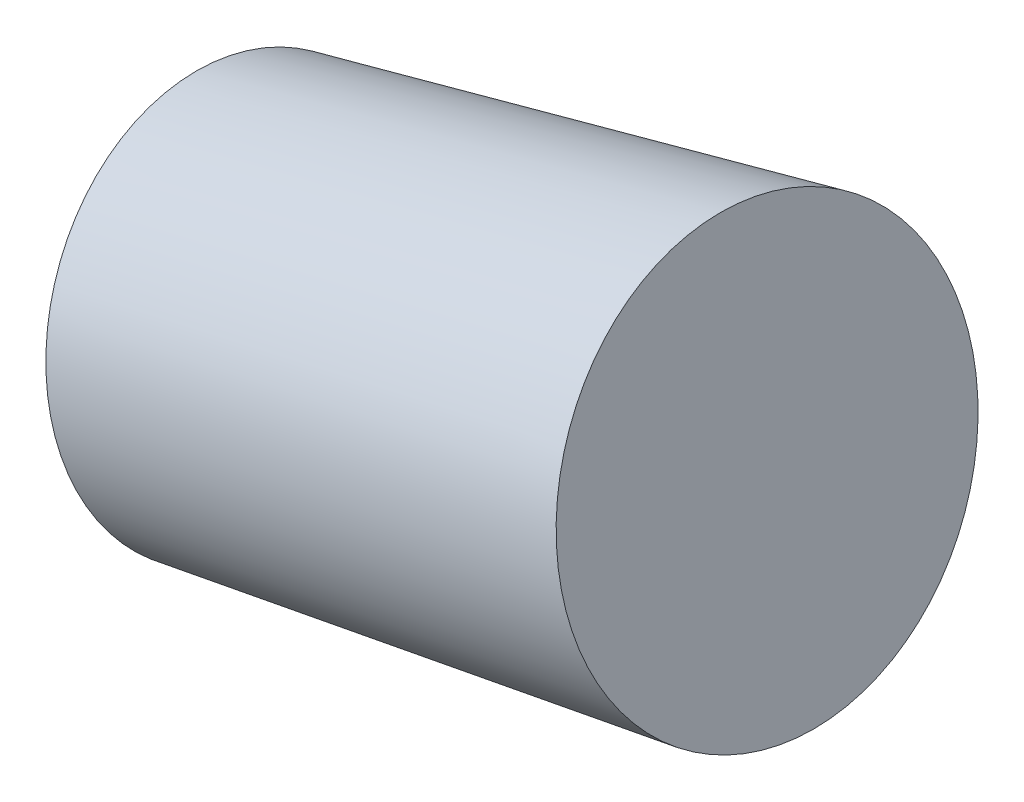
ISO-10303-21;
HEADER;
FILE_DESCRIPTION(('STEP AP214'),'2;1');
FILE_NAME('part.step','',(''),(''),'','','');
FILE_SCHEMA(('AUTOMOTIVE_DESIGN { 1 0 10303 214 1 1 1 1 }'));
ENDSEC;
DATA;
#1=APPLICATION_CONTEXT('core data for automotive mechanical design processes');
#2=APPLICATION_PROTOCOL_DEFINITION('international standard','automotive_design',2000,#1);
#3=PRODUCT_CONTEXT('',#1,'mechanical');
#4=PRODUCT('Part','Part','',(#3));
#5=PRODUCT_RELATED_PRODUCT_CATEGORY('part','',(#4));
#6=PRODUCT_DEFINITION_FORMATION('','',#4);
#7=PRODUCT_DEFINITION_CONTEXT('part definition',#1,'design');
#8=PRODUCT_DEFINITION('design','',#6,#7);
#9=PRODUCT_DEFINITION_SHAPE('','',#8);
#10=(LENGTH_UNIT() NAMED_UNIT(*) SI_UNIT(.MILLI.,.METRE.));
#11=(NAMED_UNIT(*) PLANE_ANGLE_UNIT() SI_UNIT($,.RADIAN.));
#12=(NAMED_UNIT(*) SI_UNIT($,.STERADIAN.) SOLID_ANGLE_UNIT());
#13=UNCERTAINTY_MEASURE_WITH_UNIT(LENGTH_MEASURE(1.E-05),#10,'distance_accuracy_value','');
#14=(GEOMETRIC_REPRESENTATION_CONTEXT(3) GLOBAL_UNCERTAINTY_ASSIGNED_CONTEXT((#13)) GLOBAL_UNIT_ASSIGNED_CONTEXT((#10,
#11,#12)) REPRESENTATION_CONTEXT('',''));
#15=CARTESIAN_POINT('',(0.,0.,0.));
#16=DIRECTION('',(0.,0.,1.));
#17=DIRECTION('',(1.,0.,0.));
#18=AXIS2_PLACEMENT_3D('',#15,#16,#17);
#19=CARTESIAN_POINT('',(11.7445242150461,34.0104851855759,0.));
#20=DIRECTION('',(-0.974055024170811,-0.226311311886086,0.));
#21=DIRECTION('',(0.226311311886086,-0.974055024170811,0.));
#22=AXIS2_PLACEMENT_3D('',#19,#20,#21);
#23=PLANE('',#22);
#24=CARTESIAN_POINT('',(12.6898602852431,29.9417122153859,0.));
#25=DIRECTION('',(0.97405502417081,0.226311311886088,0.));
#26=DIRECTION('',(-0.226311311886088,0.97405502417081,0.));
#27=AXIS2_PLACEMENT_3D('',#24,#25,#26);
#28=CIRCLE('',#27,4.17714900008879);
#29=CARTESIAN_POINT('',(11.7445242150893,34.0104851856324,0.));
#30=VERTEX_POINT('',#29);
#31=EDGE_CURVE('E16',#30,#30,#28,.F.);
#32=ORIENTED_EDGE('',*,*,#31,.F.);
#33=EDGE_LOOP('',(#32));
#34=FACE_BOUND('',#33,.T.);
#35=ADVANCED_FACE('F13',(#34),#23,.F.);
#36=CARTESIAN_POINT('',(1.97525501931065,27.4522877846265,0.));
#37=DIRECTION('',(0.974055024170811,0.226311311886086,0.));
#38=DIRECTION('',(-0.226311311886086,0.974055024170811,0.));
#39=AXIS2_PLACEMENT_3D('',#36,#37,#38);
#40=PLANE('',#39);
#41=CARTESIAN_POINT('',(1.97525501930982,27.4522877846263,0.));
#42=DIRECTION('',(0.97405502417081,0.226311311886088,0.));
#43=DIRECTION('',(-0.226311311886088,0.97405502417081,0.));
#44=AXIS2_PLACEMENT_3D('',#41,#42,#43);
#45=CIRCLE('',#44,3.82985099999683);
#46=CARTESIAN_POINT('',(1.10851641517229,31.1827733929988,0.));
#47=VERTEX_POINT('',#46);
#48=EDGE_CURVE('E9',#47,#47,#45,.T.);
#49=ORIENTED_EDGE('',*,*,#48,.F.);
#50=EDGE_LOOP('',(#49));
#51=FACE_BOUND('',#50,.T.);
#52=ADVANCED_FACE('F28',(#51),#40,.F.);
#53=CARTESIAN_POINT('',(12.6898602852431,29.9417122153859,0.));
#54=DIRECTION('',(0.97405502417081,0.226311311886088,0.));
#55=DIRECTION('',(-0.226311311886088,0.97405502417081,0.));
#56=AXIS2_PLACEMENT_3D('',#53,#54,#55);
#57=CONICAL_SURFACE('',#56,4.17714900008879,0.0315620609586225);
#58=ORIENTED_EDGE('',*,*,#48,.T.);
#59=EDGE_LOOP('',(#58));
#60=FACE_BOUND('',#59,.T.);
#61=ORIENTED_EDGE('',*,*,#31,.T.);
#62=EDGE_LOOP('',(#61));
#63=FACE_BOUND('',#62,.T.);
#64=ADVANCED_FACE('F25',(#60,#63),#57,.T.);
#65=CLOSED_SHELL('',(#35,#52,#64));
#66=MANIFOLD_SOLID_BREP('B1',#65);
#67=ADVANCED_BREP_SHAPE_REPRESENTATION('',(#18,#66),#14);
#68=SHAPE_DEFINITION_REPRESENTATION(#9,#67);
ENDSEC;
END-ISO-10303-21;
